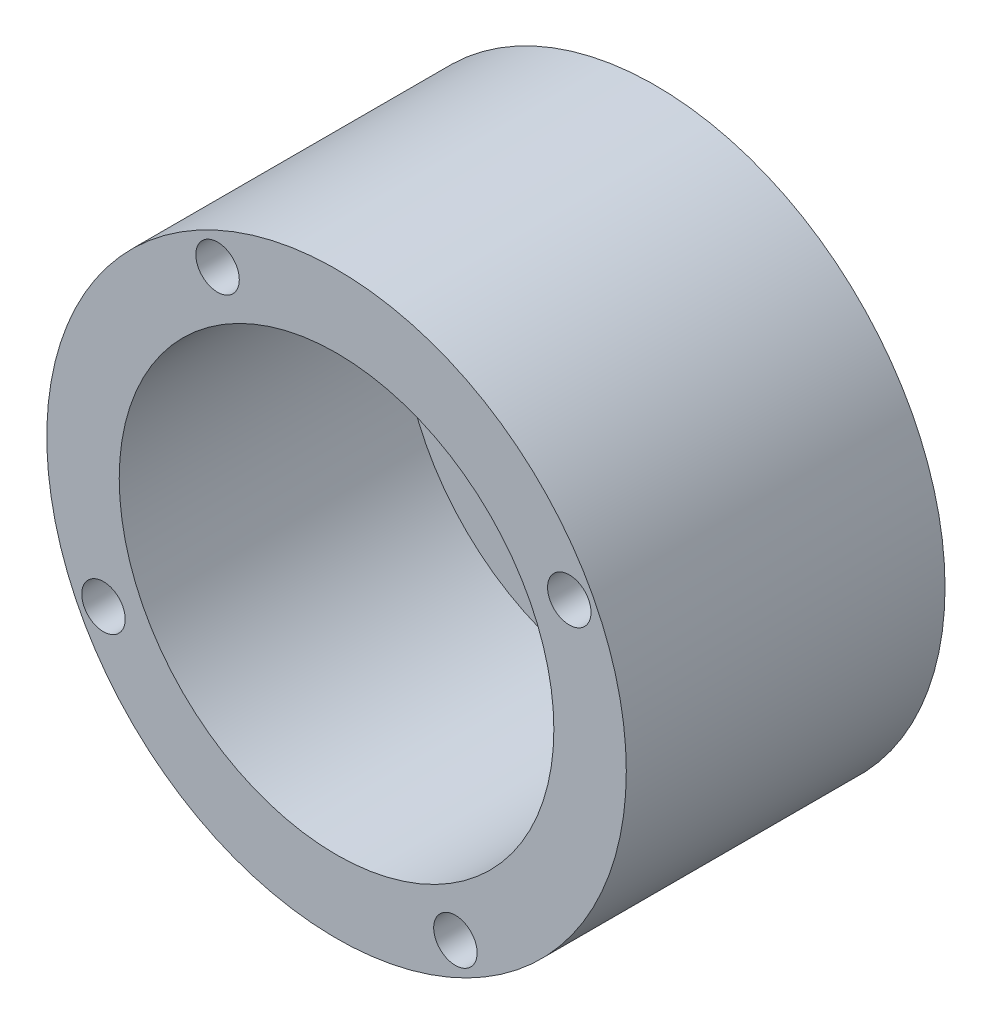
ISO-10303-21;
HEADER;
FILE_DESCRIPTION(('STEP AP214'),'2;1');
FILE_NAME('part.step','',(''),(''),'','','');
FILE_SCHEMA(('AUTOMOTIVE_DESIGN { 1 0 10303 214 1 1 1 1 }'));
ENDSEC;
DATA;
#1=APPLICATION_CONTEXT('core data for automotive mechanical design processes');
#2=APPLICATION_PROTOCOL_DEFINITION('international standard','automotive_design',2000,#1);
#3=PRODUCT_CONTEXT('',#1,'mechanical');
#4=PRODUCT('Part','Part','',(#3));
#5=PRODUCT_RELATED_PRODUCT_CATEGORY('part','',(#4));
#6=PRODUCT_DEFINITION_FORMATION('','',#4);
#7=PRODUCT_DEFINITION_CONTEXT('part definition',#1,'design');
#8=PRODUCT_DEFINITION('design','',#6,#7);
#9=PRODUCT_DEFINITION_SHAPE('','',#8);
#10=(LENGTH_UNIT() NAMED_UNIT(*) SI_UNIT(.MILLI.,.METRE.));
#11=(NAMED_UNIT(*) PLANE_ANGLE_UNIT() SI_UNIT($,.RADIAN.));
#12=(NAMED_UNIT(*) SI_UNIT($,.STERADIAN.) SOLID_ANGLE_UNIT());
#13=UNCERTAINTY_MEASURE_WITH_UNIT(LENGTH_MEASURE(1.E-05),#10,'distance_accuracy_value','');
#14=(GEOMETRIC_REPRESENTATION_CONTEXT(3) GLOBAL_UNCERTAINTY_ASSIGNED_CONTEXT((#13)) GLOBAL_UNIT_ASSIGNED_CONTEXT((#10,
#11,#12)) REPRESENTATION_CONTEXT('',''));
#15=CARTESIAN_POINT('',(0.,0.,0.));
#16=DIRECTION('',(0.,0.,1.));
#17=DIRECTION('',(1.,0.,0.));
#18=AXIS2_PLACEMENT_3D('',#15,#16,#17);
#19=CARTESIAN_POINT('',(0.,0.,22.));
#20=DIRECTION('',(0.,0.,-1.));
#21=DIRECTION('',(-1.,0.,0.));
#22=AXIS2_PLACEMENT_3D('',#19,#20,#21);
#23=CYLINDRICAL_SURFACE('',#22,15.);
#24=CARTESIAN_POINT('',(0.,0.,22.));
#25=DIRECTION('',(0.,0.,1.));
#26=DIRECTION('',(1.,0.,0.));
#27=AXIS2_PLACEMENT_3D('',#24,#25,#26);
#28=CIRCLE('',#27,15.);
#29=CARTESIAN_POINT('',(15.,0.,22.));
#30=VERTEX_POINT('',#29);
#31=EDGE_CURVE('E42',#30,#30,#28,.T.);
#32=ORIENTED_EDGE('',*,*,#31,.T.);
#33=EDGE_LOOP('',(#32));
#34=FACE_BOUND('',#33,.T.);
#35=CARTESIAN_POINT('',(0.,0.,2.5));
#36=DIRECTION('',(0.,0.,-1.));
#37=DIRECTION('',(-1.,0.,0.));
#38=AXIS2_PLACEMENT_3D('',#35,#36,#37);
#39=CIRCLE('',#38,15.);
#40=CARTESIAN_POINT('',(-15.,0.,2.5));
#41=VERTEX_POINT('',#40);
#42=EDGE_CURVE('E46',#41,#41,#39,.T.);
#43=ORIENTED_EDGE('',*,*,#42,.T.);
#44=EDGE_LOOP('',(#43));
#45=FACE_BOUND('',#44,.T.);
#46=ADVANCED_FACE('F31',(#34,#45),#23,.F.);
#47=CARTESIAN_POINT('',(0.,0.,22.));
#48=DIRECTION('',(0.,0.,1.));
#49=DIRECTION('',(1.,0.,0.));
#50=AXIS2_PLACEMENT_3D('',#47,#48,#49);
#51=PLANE('',#50);
#52=CARTESIAN_POINT('',(8.20406622151565,-16.0063025243354,22.));
#53=DIRECTION('',(0.,0.,1.));
#54=DIRECTION('',(1.,0.,0.));
#55=AXIS2_PLACEMENT_3D('',#52,#53,#54);
#56=CIRCLE('',#55,1.5);
#57=CARTESIAN_POINT('',(9.70406622151565,-16.0063025243354,22.));
#58=VERTEX_POINT('',#57);
#59=EDGE_CURVE('E74',#58,#58,#56,.T.);
#60=ORIENTED_EDGE('',*,*,#59,.F.);
#61=EDGE_LOOP('',(#60));
#62=FACE_BOUND('',#61,.T.);
#63=CARTESIAN_POINT('',(-16.0866436687099,-8.20622550215228,22.));
#64=DIRECTION('',(0.,0.,1.));
#65=DIRECTION('',(1.,0.,0.));
#66=AXIS2_PLACEMENT_3D('',#63,#64,#65);
#67=CIRCLE('',#66,1.5);
#68=CARTESIAN_POINT('',(-14.5866436687099,-8.20622550215228,22.));
#69=VERTEX_POINT('',#68);
#70=EDGE_CURVE('E68',#69,#69,#67,.T.);
#71=ORIENTED_EDGE('',*,*,#70,.F.);
#72=EDGE_LOOP('',(#71));
#73=FACE_BOUND('',#72,.T.);
#74=CARTESIAN_POINT('',(-8.21275496085916,16.0232544341245,22.));
#75=DIRECTION('',(0.,0.,1.));
#76=DIRECTION('',(1.,0.,0.));
#77=AXIS2_PLACEMENT_3D('',#74,#75,#76);
#78=CIRCLE('',#77,1.5);
#79=CARTESIAN_POINT('',(-6.71275496085916,16.0232544341245,22.));
#80=VERTEX_POINT('',#79);
#81=EDGE_CURVE('E62',#80,#80,#78,.T.);
#82=ORIENTED_EDGE('',*,*,#81,.F.);
#83=EDGE_LOOP('',(#82));
#84=FACE_BOUND('',#83,.T.);
#85=CARTESIAN_POINT('',(16.0656170115131,8.27348774773409,22.));
#86=DIRECTION('',(0.,0.,1.));
#87=DIRECTION('',(1.,0.,0.));
#88=AXIS2_PLACEMENT_3D('',#85,#86,#87);
#89=CIRCLE('',#88,1.5);
#90=CARTESIAN_POINT('',(17.5656170115131,8.27348774773409,22.));
#91=VERTEX_POINT('',#90);
#92=EDGE_CURVE('E56',#91,#91,#89,.T.);
#93=ORIENTED_EDGE('',*,*,#92,.F.);
#94=EDGE_LOOP('',(#93));
#95=FACE_BOUND('',#94,.T.);
#96=CARTESIAN_POINT('',(0.,0.,22.));
#97=DIRECTION('',(0.,0.,1.));
#98=DIRECTION('',(1.,0.,0.));
#99=AXIS2_PLACEMENT_3D('',#96,#97,#98);
#100=CIRCLE('',#99,20.);
#101=CARTESIAN_POINT('',(20.,0.,22.));
#102=VERTEX_POINT('',#101);
#103=EDGE_CURVE('E10',#102,#102,#100,.T.);
#104=ORIENTED_EDGE('',*,*,#103,.T.);
#105=EDGE_LOOP('',(#104));
#106=FACE_BOUND('',#105,.T.);
#107=ORIENTED_EDGE('',*,*,#31,.F.);
#108=EDGE_LOOP('',(#107));
#109=FACE_BOUND('',#108,.T.);
#110=ADVANCED_FACE('F89',(#62,#73,#84,#95,#106,#109),#51,.T.);
#111=CARTESIAN_POINT('',(0.,0.,0.));
#112=DIRECTION('',(0.,0.,1.));
#113=DIRECTION('',(1.,0.,0.));
#114=AXIS2_PLACEMENT_3D('',#111,#112,#113);
#115=PLANE('',#114);
#116=CARTESIAN_POINT('',(0.,0.,0.));
#117=DIRECTION('',(0.,0.,-1.));
#118=DIRECTION('',(-1.,0.,0.));
#119=AXIS2_PLACEMENT_3D('',#116,#117,#118);
#120=CIRCLE('',#119,4.25);
#121=CARTESIAN_POINT('',(-4.25,0.,0.));
#122=VERTEX_POINT('',#121);
#123=EDGE_CURVE('E50',#122,#122,#120,.T.);
#124=ORIENTED_EDGE('',*,*,#123,.F.);
#125=EDGE_LOOP('',(#124));
#126=FACE_BOUND('',#125,.T.);
#127=CARTESIAN_POINT('',(0.,0.,0.));
#128=DIRECTION('',(0.,0.,1.));
#129=DIRECTION('',(1.,0.,0.));
#130=AXIS2_PLACEMENT_3D('',#127,#128,#129);
#131=CIRCLE('',#130,20.);
#132=CARTESIAN_POINT('',(20.,0.,0.));
#133=VERTEX_POINT('',#132);
#134=EDGE_CURVE('E35',#133,#133,#131,.T.);
#135=ORIENTED_EDGE('',*,*,#134,.F.);
#136=EDGE_LOOP('',(#135));
#137=FACE_BOUND('',#136,.T.);
#138=ADVANCED_FACE('F92',(#126,#137),#115,.F.);
#139=CARTESIAN_POINT('',(0.,0.,22.));
#140=DIRECTION('',(0.,0.,-1.));
#141=DIRECTION('',(-1.,0.,0.));
#142=AXIS2_PLACEMENT_3D('',#139,#140,#141);
#143=CYLINDRICAL_SURFACE('',#142,20.);
#144=ORIENTED_EDGE('',*,*,#103,.F.);
#145=EDGE_LOOP('',(#144));
#146=FACE_BOUND('',#145,.T.);
#147=ORIENTED_EDGE('',*,*,#134,.T.);
#148=EDGE_LOOP('',(#147));
#149=FACE_BOUND('',#148,.T.);
#150=ADVANCED_FACE('F33',(#146,#149),#143,.T.);
#151=CARTESIAN_POINT('',(0.,0.,2.5));
#152=DIRECTION('',(0.,0.,-1.));
#153=DIRECTION('',(-1.,0.,0.));
#154=AXIS2_PLACEMENT_3D('',#151,#152,#153);
#155=PLANE('',#154);
#156=CARTESIAN_POINT('',(0.,0.,2.5));
#157=DIRECTION('',(0.,0.,-1.));
#158=DIRECTION('',(-1.,0.,0.));
#159=AXIS2_PLACEMENT_3D('',#156,#157,#158);
#160=CIRCLE('',#159,4.25);
#161=CARTESIAN_POINT('',(-4.25,0.,2.5));
#162=VERTEX_POINT('',#161);
#163=EDGE_CURVE('E49',#162,#162,#160,.T.);
#164=ORIENTED_EDGE('',*,*,#163,.T.);
#165=EDGE_LOOP('',(#164));
#166=FACE_BOUND('',#165,.T.);
#167=ORIENTED_EDGE('',*,*,#42,.F.);
#168=EDGE_LOOP('',(#167));
#169=FACE_BOUND('',#168,.T.);
#170=ADVANCED_FACE('F107',(#166,#169),#155,.F.);
#171=CARTESIAN_POINT('',(0.,0.,2.5));
#172=DIRECTION('',(0.,0.,-1.));
#173=DIRECTION('',(-1.,0.,0.));
#174=AXIS2_PLACEMENT_3D('',#171,#172,#173);
#175=CYLINDRICAL_SURFACE('',#174,4.25);
#176=ORIENTED_EDGE('',*,*,#163,.F.);
#177=EDGE_LOOP('',(#176));
#178=FACE_BOUND('',#177,.T.);
#179=ORIENTED_EDGE('',*,*,#123,.T.);
#180=EDGE_LOOP('',(#179));
#181=FACE_BOUND('',#180,.T.);
#182=ADVANCED_FACE('F109',(#178,#181),#175,.F.);
#183=CARTESIAN_POINT('',(16.0656170115131,8.27348774773409,16.));
#184=DIRECTION('',(0.,0.,1.));
#185=DIRECTION('',(1.,0.,0.));
#186=AXIS2_PLACEMENT_3D('',#183,#184,#185);
#187=CYLINDRICAL_SURFACE('',#186,1.5);
#188=CARTESIAN_POINT('',(16.0656170115131,8.27348774773409,16.));
#189=DIRECTION('',(0.,0.,1.));
#190=DIRECTION('',(1.,0.,0.));
#191=AXIS2_PLACEMENT_3D('',#188,#189,#190);
#192=CIRCLE('',#191,1.5);
#193=CARTESIAN_POINT('',(17.5656170115131,8.27348774773409,16.));
#194=VERTEX_POINT('',#193);
#195=EDGE_CURVE('E53',#194,#194,#192,.T.);
#196=ORIENTED_EDGE('',*,*,#195,.F.);
#197=EDGE_LOOP('',(#196));
#198=FACE_BOUND('',#197,.T.);
#199=ORIENTED_EDGE('',*,*,#92,.T.);
#200=EDGE_LOOP('',(#199));
#201=FACE_BOUND('',#200,.T.);
#202=ADVANCED_FACE('F116',(#198,#201),#187,.F.);
#203=CARTESIAN_POINT('',(16.0656170115131,8.27348774773409,16.));
#204=DIRECTION('',(0.,0.,1.));
#205=DIRECTION('',(1.,0.,0.));
#206=AXIS2_PLACEMENT_3D('',#203,#204,#205);
#207=PLANE('',#206);
#208=ORIENTED_EDGE('',*,*,#195,.T.);
#209=EDGE_LOOP('',(#208));
#210=FACE_BOUND('',#209,.T.);
#211=ADVANCED_FACE('F167',(#210),#207,.T.);
#212=CARTESIAN_POINT('',(-8.21275496085916,16.0232544341245,16.));
#213=DIRECTION('',(0.,0.,1.));
#214=DIRECTION('',(1.,0.,0.));
#215=AXIS2_PLACEMENT_3D('',#212,#213,#214);
#216=CYLINDRICAL_SURFACE('',#215,1.5);
#217=CARTESIAN_POINT('',(-8.21275496085916,16.0232544341245,16.));
#218=DIRECTION('',(0.,0.,1.));
#219=DIRECTION('',(1.,0.,0.));
#220=AXIS2_PLACEMENT_3D('',#217,#218,#219);
#221=CIRCLE('',#220,1.5);
#222=CARTESIAN_POINT('',(-6.71275496085916,16.0232544341245,16.));
#223=VERTEX_POINT('',#222);
#224=EDGE_CURVE('E65',#223,#223,#221,.T.);
#225=ORIENTED_EDGE('',*,*,#224,.F.);
#226=EDGE_LOOP('',(#225));
#227=FACE_BOUND('',#226,.T.);
#228=ORIENTED_EDGE('',*,*,#81,.T.);
#229=EDGE_LOOP('',(#228));
#230=FACE_BOUND('',#229,.T.);
#231=ADVANCED_FACE('F175',(#227,#230),#216,.F.);
#232=CARTESIAN_POINT('',(-8.21275496085916,16.0232544341245,16.));
#233=DIRECTION('',(0.,0.,1.));
#234=DIRECTION('',(1.,0.,0.));
#235=AXIS2_PLACEMENT_3D('',#232,#233,#234);
#236=PLANE('',#235);
#237=ORIENTED_EDGE('',*,*,#224,.T.);
#238=EDGE_LOOP('',(#237));
#239=FACE_BOUND('',#238,.T.);
#240=ADVANCED_FACE('F184',(#239),#236,.T.);
#241=CARTESIAN_POINT('',(-16.0866436687099,-8.20622550215228,16.));
#242=DIRECTION('',(0.,0.,1.));
#243=DIRECTION('',(1.,0.,0.));
#244=AXIS2_PLACEMENT_3D('',#241,#242,#243);
#245=CYLINDRICAL_SURFACE('',#244,1.5);
#246=CARTESIAN_POINT('',(-16.0866436687099,-8.20622550215228,16.));
#247=DIRECTION('',(0.,0.,1.));
#248=DIRECTION('',(1.,0.,0.));
#249=AXIS2_PLACEMENT_3D('',#246,#247,#248);
#250=CIRCLE('',#249,1.5);
#251=CARTESIAN_POINT('',(-14.5866436687099,-8.20622550215228,16.));
#252=VERTEX_POINT('',#251);
#253=EDGE_CURVE('E71',#252,#252,#250,.T.);
#254=ORIENTED_EDGE('',*,*,#253,.F.);
#255=EDGE_LOOP('',(#254));
#256=FACE_BOUND('',#255,.T.);
#257=ORIENTED_EDGE('',*,*,#70,.T.);
#258=EDGE_LOOP('',(#257));
#259=FACE_BOUND('',#258,.T.);
#260=ADVANCED_FACE('F193',(#256,#259),#245,.F.);
#261=CARTESIAN_POINT('',(-16.0866436687099,-8.20622550215228,16.));
#262=DIRECTION('',(0.,0.,1.));
#263=DIRECTION('',(1.,0.,0.));
#264=AXIS2_PLACEMENT_3D('',#261,#262,#263);
#265=PLANE('',#264);
#266=ORIENTED_EDGE('',*,*,#253,.T.);
#267=EDGE_LOOP('',(#266));
#268=FACE_BOUND('',#267,.T.);
#269=ADVANCED_FACE('F85',(#268),#265,.T.);
#270=CARTESIAN_POINT('',(8.20406622151565,-16.0063025243354,16.));
#271=DIRECTION('',(0.,0.,1.));
#272=DIRECTION('',(1.,0.,0.));
#273=AXIS2_PLACEMENT_3D('',#270,#271,#272);
#274=CYLINDRICAL_SURFACE('',#273,1.5);
#275=CARTESIAN_POINT('',(8.20406622151565,-16.0063025243354,16.));
#276=DIRECTION('',(0.,0.,1.));
#277=DIRECTION('',(1.,0.,0.));
#278=AXIS2_PLACEMENT_3D('',#275,#276,#277);
#279=CIRCLE('',#278,1.5);
#280=CARTESIAN_POINT('',(9.70406622151565,-16.0063025243354,16.));
#281=VERTEX_POINT('',#280);
#282=EDGE_CURVE('E59',#281,#281,#279,.T.);
#283=ORIENTED_EDGE('',*,*,#282,.F.);
#284=EDGE_LOOP('',(#283));
#285=FACE_BOUND('',#284,.T.);
#286=ORIENTED_EDGE('',*,*,#59,.T.);
#287=EDGE_LOOP('',(#286));
#288=FACE_BOUND('',#287,.T.);
#289=ADVANCED_FACE('F82',(#285,#288),#274,.F.);
#290=CARTESIAN_POINT('',(8.20406622151565,-16.0063025243354,16.));
#291=DIRECTION('',(0.,0.,1.));
#292=DIRECTION('',(1.,0.,0.));
#293=AXIS2_PLACEMENT_3D('',#290,#291,#292);
#294=PLANE('',#293);
#295=ORIENTED_EDGE('',*,*,#282,.T.);
#296=EDGE_LOOP('',(#295));
#297=FACE_BOUND('',#296,.T.);
#298=ADVANCED_FACE('F80',(#297),#294,.T.);
#299=CLOSED_SHELL('',(#46,#110,#138,#150,#170,#182,#202,#211,#231,#240,#260,#269,#289,#298));
#300=MANIFOLD_SOLID_BREP('B2',#299);
#301=ADVANCED_BREP_SHAPE_REPRESENTATION('',(#18,#300),#14);
#302=SHAPE_DEFINITION_REPRESENTATION(#9,#301);
ENDSEC;
END-ISO-10303-21;
